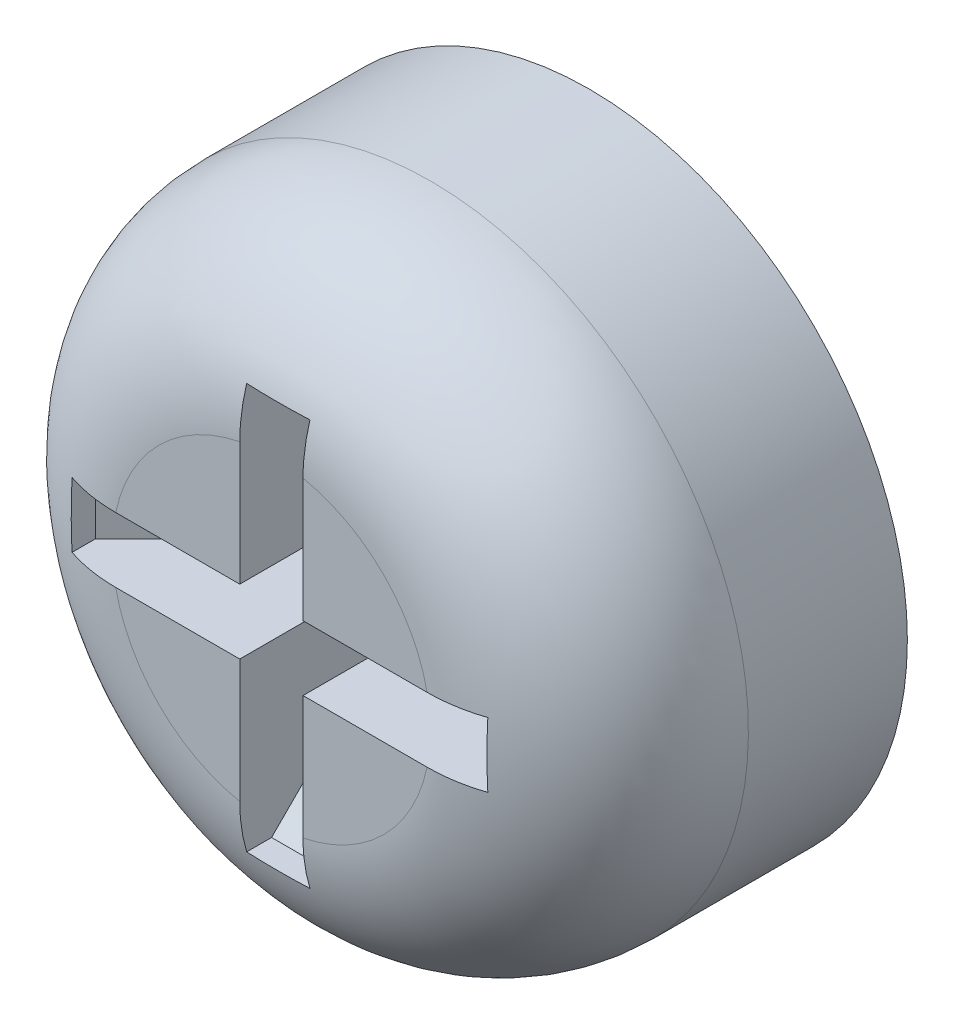
ISO-10303-21;
HEADER;
FILE_DESCRIPTION(('STEP AP214'),'2;1');
FILE_NAME('part.step','',(''),(''),'','','');
FILE_SCHEMA(('AUTOMOTIVE_DESIGN { 1 0 10303 214 1 1 1 1 }'));
ENDSEC;
DATA;
#1=APPLICATION_CONTEXT('core data for automotive mechanical design processes');
#2=APPLICATION_PROTOCOL_DEFINITION('international standard','automotive_design',2000,#1);
#3=PRODUCT_CONTEXT('',#1,'mechanical');
#4=PRODUCT('Part','Part','',(#3));
#5=PRODUCT_RELATED_PRODUCT_CATEGORY('part','',(#4));
#6=PRODUCT_DEFINITION_FORMATION('','',#4);
#7=PRODUCT_DEFINITION_CONTEXT('part definition',#1,'design');
#8=PRODUCT_DEFINITION('design','',#6,#7);
#9=PRODUCT_DEFINITION_SHAPE('','',#8);
#10=(LENGTH_UNIT() NAMED_UNIT(*) SI_UNIT(.MILLI.,.METRE.));
#11=(NAMED_UNIT(*) PLANE_ANGLE_UNIT() SI_UNIT($,.RADIAN.));
#12=(NAMED_UNIT(*) SI_UNIT($,.STERADIAN.) SOLID_ANGLE_UNIT());
#13=UNCERTAINTY_MEASURE_WITH_UNIT(LENGTH_MEASURE(1.E-05),#10,'distance_accuracy_value','');
#14=(GEOMETRIC_REPRESENTATION_CONTEXT(3) GLOBAL_UNCERTAINTY_ASSIGNED_CONTEXT((#13)) GLOBAL_UNIT_ASSIGNED_CONTEXT((#10,
#11,#12)) REPRESENTATION_CONTEXT('',''));
#15=CARTESIAN_POINT('',(0.,0.,0.));
#16=DIRECTION('',(0.,0.,1.));
#17=DIRECTION('',(1.,0.,0.));
#18=AXIS2_PLACEMENT_3D('',#15,#16,#17);
#19=CARTESIAN_POINT('',(25.3989609185,-17.47602795822,-1.7));
#20=DIRECTION('',(0.,0.707106781186498,0.707106781186598));
#21=DIRECTION('',(0.,-0.707106781186598,0.707106781186498));
#22=AXIS2_PLACEMENT_3D('',#19,#20,#21);
#23=PLANE('',#22);
#24=DIRECTION('',(1.,0.,0.));
#25=VECTOR('',#24,1.);
#26=CARTESIAN_POINT('',(25.3989609185,-17.47602795822,-1.7));
#27=LINE('',#26,#25);
#28=CARTESIAN_POINT('',(25.3989609185,-17.47602795822,-1.7));
#29=VERTEX_POINT('',#28);
#30=CARTESIAN_POINT('',(25.0010390815,-17.47602795822,-1.7));
#31=VERTEX_POINT('',#30);
#32=EDGE_CURVE('E428',#29,#31,#27,.F.);
#33=ORIENTED_EDGE('',*,*,#32,.T.);
#34=DIRECTION('',(0.,-0.707106781186548,0.707106781186547));
#35=VECTOR('',#34,1.);
#36=CARTESIAN_POINT('',(25.0010390815,-17.47602795822,-1.7));
#37=LINE('',#36,#35);
#38=CARTESIAN_POINT('',(25.0010390815,-18.47602795822,-0.700000000000023));
#39=VERTEX_POINT('',#38);
#40=EDGE_CURVE('E175',#31,#39,#37,.T.);
#41=ORIENTED_EDGE('',*,*,#40,.T.);
#42=DIRECTION('',(1.,0.,0.));
#43=VECTOR('',#42,1.);
#44=CARTESIAN_POINT('',(25.3989609185,-18.4760279582201,-0.70000000000007));
#45=LINE('',#44,#43);
#46=CARTESIAN_POINT('',(25.3989609185,-18.47602795822,-0.700000000000023));
#47=VERTEX_POINT('',#46);
#48=EDGE_CURVE('E431',#39,#47,#45,.T.);
#49=ORIENTED_EDGE('',*,*,#48,.T.);
#50=DIRECTION('',(0.,0.707106781186548,-0.707106781186547));
#51=VECTOR('',#50,1.);
#52=CARTESIAN_POINT('',(25.3989609185,-18.47602795822,-0.7));
#53=LINE('',#52,#51);
#54=EDGE_CURVE('E374',#47,#29,#53,.T.);
#55=ORIENTED_EDGE('',*,*,#54,.T.);
#56=EDGE_LOOP('',(#33,#41,#49,#55));
#57=FACE_BOUND('',#56,.T.);
#58=ADVANCED_FACE('F17',(#57),#23,.T.);
#59=CARTESIAN_POINT('',(24.89255224611,-16.99614004198,-1.7));
#60=DIRECTION('',(0.707106781186498,0.,0.707106781186598));
#61=DIRECTION('',(0.707106781186598,0.,-0.707106781186498));
#62=AXIS2_PLACEMENT_3D('',#59,#60,#61);
#63=PLANE('',#62);
#64=DIRECTION('',(0.,1.,0.));
#65=VECTOR('',#64,1.);
#66=CARTESIAN_POINT('',(24.89255224611,-16.99614004198,-1.7));
#67=LINE('',#66,#65);
#68=CARTESIAN_POINT('',(24.89255224611,-17.40385995802,-1.7));
#69=VERTEX_POINT('',#68);
#70=CARTESIAN_POINT('',(24.89255224611,-16.99614004198,-1.7));
#71=VERTEX_POINT('',#70);
#72=EDGE_CURVE('E394',#69,#71,#67,.T.);
#73=ORIENTED_EDGE('',*,*,#72,.T.);
#74=DIRECTION('',(-0.707106781186548,0.,0.707106781186547));
#75=VECTOR('',#74,1.);
#76=CARTESIAN_POINT('',(24.89255224611,-16.99614004198,-1.7));
#77=LINE('',#76,#75);
#78=CARTESIAN_POINT('',(23.89255224611,-16.99614004198,-0.700000000000023));
#79=VERTEX_POINT('',#78);
#80=EDGE_CURVE('E347',#71,#79,#77,.T.);
#81=ORIENTED_EDGE('',*,*,#80,.T.);
#82=DIRECTION('',(0.,1.,0.));
#83=VECTOR('',#82,1.);
#84=CARTESIAN_POINT('',(23.8925522461099,-16.99614004198,-0.70000000000007));
#85=LINE('',#84,#83);
#86=CARTESIAN_POINT('',(23.89255224611,-17.40385995802,-0.700000000000023));
#87=VERTEX_POINT('',#86);
#88=EDGE_CURVE('E423',#79,#87,#85,.F.);
#89=ORIENTED_EDGE('',*,*,#88,.T.);
#90=DIRECTION('',(0.707106781186548,0.,-0.707106781186547));
#91=VECTOR('',#90,1.);
#92=CARTESIAN_POINT('',(23.89255224611,-17.40385995802,-0.7));
#93=LINE('',#92,#91);
#94=EDGE_CURVE('E182',#87,#69,#93,.T.);
#95=ORIENTED_EDGE('',*,*,#94,.T.);
#96=EDGE_LOOP('',(#73,#81,#89,#95));
#97=FACE_BOUND('',#96,.T.);
#98=ADVANCED_FACE('F207',(#97),#63,.T.);
#99=CARTESIAN_POINT('',(25.3989609185,-16.92397204178,-1.7));
#100=DIRECTION('',(0.,-0.707106781186498,0.707106781186598));
#101=DIRECTION('',(0.,-0.707106781186598,-0.707106781186498));
#102=AXIS2_PLACEMENT_3D('',#99,#100,#101);
#103=PLANE('',#102);
#104=DIRECTION('',(-1.,0.,0.));
#105=VECTOR('',#104,1.);
#106=CARTESIAN_POINT('',(25.3989609185,-16.92397204178,-1.7));
#107=LINE('',#106,#105);
#108=CARTESIAN_POINT('',(25.0010390815,-16.92397204178,-1.7));
#109=VERTEX_POINT('',#108);
#110=CARTESIAN_POINT('',(25.3989609185,-16.92397204178,-1.7));
#111=VERTEX_POINT('',#110);
#112=EDGE_CURVE('E137',#109,#111,#107,.F.);
#113=ORIENTED_EDGE('',*,*,#112,.T.);
#114=DIRECTION('',(0.,0.707106781186548,0.707106781186547));
#115=VECTOR('',#114,1.);
#116=CARTESIAN_POINT('',(25.3989609185,-16.92397204178,-1.7));
#117=LINE('',#116,#115);
#118=CARTESIAN_POINT('',(25.3989609185,-15.92397204178,-0.700000000000023));
#119=VERTEX_POINT('',#118);
#120=EDGE_CURVE('E318',#111,#119,#117,.T.);
#121=ORIENTED_EDGE('',*,*,#120,.T.);
#122=DIRECTION('',(1.,0.,0.));
#123=VECTOR('',#122,1.);
#124=CARTESIAN_POINT('',(25.3989609185,-15.9239720417799,-0.70000000000007));
#125=LINE('',#124,#123);
#126=CARTESIAN_POINT('',(25.0010390815,-15.92397204178,-0.700000000000023));
#127=VERTEX_POINT('',#126);
#128=EDGE_CURVE('E103',#119,#127,#125,.F.);
#129=ORIENTED_EDGE('',*,*,#128,.T.);
#130=DIRECTION('',(0.,-0.707106781186548,-0.707106781186547));
#131=VECTOR('',#130,1.);
#132=CARTESIAN_POINT('',(25.0010390815,-15.92397204178,-0.7));
#133=LINE('',#132,#131);
#134=EDGE_CURVE('E352',#127,#109,#133,.T.);
#135=ORIENTED_EDGE('',*,*,#134,.T.);
#136=EDGE_LOOP('',(#113,#121,#129,#135));
#137=FACE_BOUND('',#136,.T.);
#138=ADVANCED_FACE('F204',(#137),#103,.T.);
#139=CARTESIAN_POINT('',(25.3989609185,-17.40385995802,-1.7));
#140=DIRECTION('',(1.,0.,0.));
#141=DIRECTION('',(0.,0.,-1.));
#142=AXIS2_PLACEMENT_3D('',#139,#140,#141);
#143=PLANE('',#142);
#144=DIRECTION('',(0.,0.,-1.));
#145=VECTOR('',#144,1.);
#146=CARTESIAN_POINT('',(25.3989609185,-18.47602795822,-1.7));
#147=LINE('',#146,#145);
#148=CARTESIAN_POINT('',(25.3989609185,-18.47602795822,-0.543412720583564));
#149=VERTEX_POINT('',#148);
#150=EDGE_CURVE('E99',#149,#47,#147,.T.);
#151=ORIENTED_EDGE('',*,*,#150,.F.);
#152=CARTESIAN_POINT('',(25.3989609185,-18.1800074249283,-0.500000000000001));
#153=CARTESIAN_POINT('',(25.3989609185,-18.2300853910277,-0.499980357796871));
#154=CARTESIAN_POINT('',(25.3989609185,-18.2801184198633,-0.503616686595251));
#155=CARTESIAN_POINT('',(25.3989609185,-18.3543002289747,-0.514478317278701));
#156=CARTESIAN_POINT('',(25.3989609185,-18.3788592300385,-0.518992986288768));
#157=CARTESIAN_POINT('',(25.3989609185,-18.4277108091085,-0.529837370422199));
#158=CARTESIAN_POINT('',(25.3989609185,-18.452001260971,-0.536176659609582));
#159=CARTESIAN_POINT('',(25.3989609185,-18.47602795822,-0.543412720583619));
#160=B_SPLINE_CURVE_WITH_KNOTS('',3,(#152,#153,#154,#155,#156,#157,#158,#159),.UNSPECIFIED.,.F.,
.F.,(4,2,2,4),(0.,0.14999162541346,0.22484086434075,0.300090241175782),.UNSPECIFIED.);
#161=CARTESIAN_POINT('',(25.3989609185,-18.1800074249278,-0.500000000000001));
#162=VERTEX_POINT('',#161);
#163=EDGE_CURVE('E22',#162,#149,#160,.T.);
#164=ORIENTED_EDGE('',*,*,#163,.F.);
#165=DIRECTION('',(0.,1.,0.));
#166=VECTOR('',#165,1.);
#167=CARTESIAN_POINT('',(25.3989609185,-17.2,-0.5));
#168=LINE('',#167,#166);
#169=CARTESIAN_POINT('',(25.3989609185,-17.40385995802,-0.5));
#170=VERTEX_POINT('',#169);
#171=EDGE_CURVE('E96',#170,#162,#168,.F.);
#172=ORIENTED_EDGE('',*,*,#171,.F.);
#173=DIRECTION('',(0.,0.,1.));
#174=VECTOR('',#173,1.);
#175=CARTESIAN_POINT('',(25.3989609185,-17.40385995802,-1.7));
#176=LINE('',#175,#174);
#177=CARTESIAN_POINT('',(25.3989609185,-17.40385995802,-1.7));
#178=VERTEX_POINT('',#177);
#179=EDGE_CURVE('E188',#170,#178,#176,.F.);
#180=ORIENTED_EDGE('',*,*,#179,.T.);
#181=DIRECTION('',(0.,1.,0.));
#182=VECTOR('',#181,1.);
#183=CARTESIAN_POINT('',(25.3989609185,-16.99614004198,-1.7));
#184=LINE('',#183,#182);
#185=EDGE_CURVE('E385',#178,#29,#184,.F.);
#186=ORIENTED_EDGE('',*,*,#185,.T.);
#187=ORIENTED_EDGE('',*,*,#54,.F.);
#188=EDGE_LOOP('',(#151,#164,#172,#180,#186,#187));
#189=FACE_BOUND('',#188,.T.);
#190=ADVANCED_FACE('F93',(#189),#143,.F.);
#191=CARTESIAN_POINT('',(26.50744775389,-17.40385995802,-1.7));
#192=DIRECTION('',(0.,-1.,0.));
#193=DIRECTION('',(1.,0.,0.));
#194=AXIS2_PLACEMENT_3D('',#191,#192,#193);
#195=PLANE('',#194);
#196=DIRECTION('',(-1.,0.,0.));
#197=VECTOR('',#196,1.);
#198=CARTESIAN_POINT('',(25.3989609185,-17.40385995802,-1.7));
#199=LINE('',#198,#197);
#200=CARTESIAN_POINT('',(25.50744775389,-17.40385995802,-1.7));
#201=VERTEX_POINT('',#200);
#202=EDGE_CURVE('E357',#201,#178,#199,.T.);
#203=ORIENTED_EDGE('',*,*,#202,.T.);
#204=ORIENTED_EDGE('',*,*,#179,.F.);
#205=DIRECTION('',(1.,0.,0.));
#206=VECTOR('',#205,1.);
#207=CARTESIAN_POINT('',(25.2,-17.40385995802,-0.5));
#208=LINE('',#207,#206);
#209=CARTESIAN_POINT('',(26.1790000600197,-17.40385995802,-0.500000000000001));
#210=VERTEX_POINT('',#209);
#211=EDGE_CURVE('E110',#210,#170,#208,.F.);
#212=ORIENTED_EDGE('',*,*,#211,.F.);
#213=CARTESIAN_POINT('',(26.5074477538897,-17.40385995802,-0.553684840378902));
#214=CARTESIAN_POINT('',(26.4809616911325,-17.40385995802,-0.544740749820176));
#215=CARTESIAN_POINT('',(26.4541118836972,-17.40385995802,-0.536901162363056));
#216=CARTESIAN_POINT('',(26.4000380078882,-17.40385995802,-0.52349492906921));
#217=CARTESIAN_POINT('',(26.3728175657446,-17.40385995802,-0.517913663442635));
#218=CARTESIAN_POINT('',(26.2904621558708,-17.40385995802,-0.50447630877751));
#219=CARTESIAN_POINT('',(26.2347621564866,-17.40385995802,-0.499969818068343));
#220=CARTESIAN_POINT('',(26.1790000600194,-17.40385995802,-0.500000000000001));
#221=B_SPLINE_CURVE_WITH_KNOTS('',3,(#213,#214,#215,#216,#217,#218,#219,#220),.UNSPECIFIED.,.F.,
.F.,(4,2,2,4),(0.,0.0838260991151288,0.167100496555799,0.334052422074311),.UNSPECIFIED.);
#222=CARTESIAN_POINT('',(26.5074477538898,-17.40385995802,-0.553684840378889));
#223=VERTEX_POINT('',#222);
#224=EDGE_CURVE('E116',#223,#210,#221,.T.);
#225=ORIENTED_EDGE('',*,*,#224,.F.);
#226=DIRECTION('',(0.,0.,1.));
#227=VECTOR('',#226,1.);
#228=CARTESIAN_POINT('',(26.50744775389,-17.40385995802,-1.7));
#229=LINE('',#228,#227);
#230=CARTESIAN_POINT('',(26.50744775389,-17.40385995802,-0.700000000000047));
#231=VERTEX_POINT('',#230);
#232=EDGE_CURVE('E371',#231,#223,#229,.T.);
#233=ORIENTED_EDGE('',*,*,#232,.F.);
#234=DIRECTION('',(0.707106781186598,0.,0.707106781186498));
#235=VECTOR('',#234,1.);
#236=CARTESIAN_POINT('',(25.50744775389,-17.40385995802,-1.7));
#237=LINE('',#236,#235);
#238=EDGE_CURVE('E111',#201,#231,#237,.T.);
#239=ORIENTED_EDGE('',*,*,#238,.F.);
#240=EDGE_LOOP('',(#203,#204,#212,#225,#233,#239));
#241=FACE_BOUND('',#240,.T.);
#242=ADVANCED_FACE('F196',(#241),#195,.F.);
#243=CARTESIAN_POINT('',(25.0010390815,-17.40385995802,-1.7));
#244=DIRECTION('',(0.,-1.,0.));
#245=DIRECTION('',(1.,0.,0.));
#246=AXIS2_PLACEMENT_3D('',#243,#244,#245);
#247=PLANE('',#246);
#248=DIRECTION('',(0.,0.,1.));
#249=VECTOR('',#248,1.);
#250=CARTESIAN_POINT('',(23.89255224611,-17.40385995802,-1.7));
#251=LINE('',#250,#249);
#252=CARTESIAN_POINT('',(23.89255224611,-17.4038599580199,-0.553684840377949));
#253=VERTEX_POINT('',#252);
#254=EDGE_CURVE('E187',#253,#87,#251,.F.);
#255=ORIENTED_EDGE('',*,*,#254,.F.);
#256=CARTESIAN_POINT('',(24.2209999399806,-17.40385995802,-0.500000000000001));
#257=CARTESIAN_POINT('',(24.1652378435135,-17.40385995802,-0.499969818068343));
#258=CARTESIAN_POINT('',(24.1095378441293,-17.40385995802,-0.5044763087775));
#259=CARTESIAN_POINT('',(24.0271824342556,-17.40385995802,-0.517913663442597));
#260=CARTESIAN_POINT('',(23.999961992112,-17.40385995802,-0.52349492906916));
#261=CARTESIAN_POINT('',(23.9458881163031,-17.40385995802,-0.536901162362978));
#262=CARTESIAN_POINT('',(23.9190383088679,-17.40385995802,-0.544740749820081));
#263=CARTESIAN_POINT('',(23.8925522461106,-17.40385995802,-0.553684840378789));
#264=B_SPLINE_CURVE_WITH_KNOTS('',3,(#256,#257,#258,#259,#260,#261,#262,#263),.UNSPECIFIED.,.F.,
.F.,(4,2,2,4),(0.,0.166951925518336,0.250226322958922,0.33405242207396),.UNSPECIFIED.);
#265=CARTESIAN_POINT('',(24.220999939979,-17.40385995802,-0.500000000000001));
#266=VERTEX_POINT('',#265);
#267=EDGE_CURVE('E183',#266,#253,#264,.T.);
#268=ORIENTED_EDGE('',*,*,#267,.F.);
#269=DIRECTION('',(1.,0.,0.));
#270=VECTOR('',#269,1.);
#271=CARTESIAN_POINT('',(25.2,-17.40385995802,-0.5));
#272=LINE('',#271,#270);
#273=CARTESIAN_POINT('',(25.0010390815,-17.40385995802,-0.5));
#274=VERTEX_POINT('',#273);
#275=EDGE_CURVE('E289',#274,#266,#272,.F.);
#276=ORIENTED_EDGE('',*,*,#275,.F.);
#277=DIRECTION('',(0.,0.,1.));
#278=VECTOR('',#277,1.);
#279=CARTESIAN_POINT('',(25.0010390815,-17.40385995802,-1.7));
#280=LINE('',#279,#278);
#281=CARTESIAN_POINT('',(25.0010390815,-17.40385995802,-1.7));
#282=VERTEX_POINT('',#281);
#283=EDGE_CURVE('E181',#274,#282,#280,.F.);
#284=ORIENTED_EDGE('',*,*,#283,.T.);
#285=DIRECTION('',(-1.,0.,0.));
#286=VECTOR('',#285,1.);
#287=CARTESIAN_POINT('',(25.3989609185,-17.40385995802,-1.7));
#288=LINE('',#287,#286);
#289=EDGE_CURVE('E413',#282,#69,#288,.T.);
#290=ORIENTED_EDGE('',*,*,#289,.T.);
#291=ORIENTED_EDGE('',*,*,#94,.F.);
#292=EDGE_LOOP('',(#255,#268,#276,#284,#290,#291));
#293=FACE_BOUND('',#292,.T.);
#294=ADVANCED_FACE('F193',(#293),#247,.F.);
#295=CARTESIAN_POINT('',(25.0010390815,-17.40385995802,-1.7));
#296=DIRECTION('',(-1.,0.,0.));
#297=DIRECTION('',(0.,0.,1.));
#298=AXIS2_PLACEMENT_3D('',#295,#296,#297);
#299=PLANE('',#298);
#300=DIRECTION('',(0.,1.,0.));
#301=VECTOR('',#300,1.);
#302=CARTESIAN_POINT('',(25.0010390815,-16.99614004198,-1.7));
#303=LINE('',#302,#301);
#304=EDGE_CURVE('E418',#31,#282,#303,.T.);
#305=ORIENTED_EDGE('',*,*,#304,.T.);
#306=ORIENTED_EDGE('',*,*,#283,.F.);
#307=DIRECTION('',(0.,1.,0.));
#308=VECTOR('',#307,1.);
#309=CARTESIAN_POINT('',(25.0010390815,-17.2,-0.5));
#310=LINE('',#309,#308);
#311=CARTESIAN_POINT('',(25.0010390815,-18.1800074249292,-0.500000000000001));
#312=VERTEX_POINT('',#311);
#313=EDGE_CURVE('E287',#312,#274,#310,.T.);
#314=ORIENTED_EDGE('',*,*,#313,.F.);
#315=CARTESIAN_POINT('',(25.0010390815,-18.4760279582202,-0.543412720583684));
#316=CARTESIAN_POINT('',(25.0010390815,-18.4520012609712,-0.536176659609636));
#317=CARTESIAN_POINT('',(25.0010390815,-18.4277108091087,-0.529837370422244));
#318=CARTESIAN_POINT('',(25.0010390815,-18.3788592300387,-0.518992986288797));
#319=CARTESIAN_POINT('',(25.0010390815,-18.3543002289748,-0.514478317278722));
#320=CARTESIAN_POINT('',(25.0010390815,-18.2801184198633,-0.503616686595257));
#321=CARTESIAN_POINT('',(25.0010390815,-18.2300853910277,-0.499980357796872));
#322=CARTESIAN_POINT('',(25.0010390815,-18.1800074249283,-0.500000000000001));
#323=B_SPLINE_CURVE_WITH_KNOTS('',3,(#315,#316,#317,#318,#319,#320,#321,#322),.UNSPECIFIED.,.F.,
.F.,(4,2,2,4),(0.,0.0752493768350856,0.150098615762434,0.300090241176003),.UNSPECIFIED.);
#324=CARTESIAN_POINT('',(25.0010390815,-18.4760279582201,-0.543412720583992));
#325=VERTEX_POINT('',#324);
#326=EDGE_CURVE('E176',#325,#312,#323,.T.);
#327=ORIENTED_EDGE('',*,*,#326,.F.);
#328=DIRECTION('',(0.,0.,-1.));
#329=VECTOR('',#328,1.);
#330=CARTESIAN_POINT('',(25.0010390815,-18.47602795822,-1.7));
#331=LINE('',#330,#329);
#332=EDGE_CURVE('E291',#325,#39,#331,.T.);
#333=ORIENTED_EDGE('',*,*,#332,.T.);
#334=ORIENTED_EDGE('',*,*,#40,.F.);
#335=EDGE_LOOP('',(#305,#306,#314,#327,#333,#334));
#336=FACE_BOUND('',#335,.T.);
#337=ADVANCED_FACE('F164',(#336),#299,.F.);
#338=CARTESIAN_POINT('',(25.0010390815,-15.92397204178,-1.7));
#339=DIRECTION('',(-1.,0.,0.));
#340=DIRECTION('',(0.,-1.,0.));
#341=AXIS2_PLACEMENT_3D('',#338,#339,#340);
#342=PLANE('',#341);
#343=DIRECTION('',(0.,0.,1.));
#344=VECTOR('',#343,1.);
#345=CARTESIAN_POINT('',(25.0010390815,-15.92397204178,-1.7));
#346=LINE('',#345,#344);
#347=CARTESIAN_POINT('',(25.0010390815,-15.92397204178,-0.543412720583561));
#348=VERTEX_POINT('',#347);
#349=EDGE_CURVE('E174',#348,#127,#346,.F.);
#350=ORIENTED_EDGE('',*,*,#349,.F.);
#351=CARTESIAN_POINT('',(25.0010390815,-16.2199925750717,-0.499999999999994));
#352=CARTESIAN_POINT('',(25.0010390815,-16.1699146089723,-0.499980357796868));
#353=CARTESIAN_POINT('',(25.0010390815,-16.1198815801367,-0.503616686595251));
#354=CARTESIAN_POINT('',(25.0010390815,-16.0456997710253,-0.514478317278702));
#355=CARTESIAN_POINT('',(25.0010390815,-16.0211407699615,-0.51899298628877));
#356=CARTESIAN_POINT('',(25.0010390815,-15.9722891908915,-0.529837370422198));
#357=CARTESIAN_POINT('',(25.0010390815,-15.947998739029,-0.536176659609579));
#358=CARTESIAN_POINT('',(25.0010390815,-15.92397204178,-0.543412720583613));
#359=B_SPLINE_CURVE_WITH_KNOTS('',3,(#351,#352,#353,#354,#355,#356,#357,#358),.UNSPECIFIED.,.F.,
.F.,(4,2,2,4),(0.,0.149991625413454,0.224840864340744,0.30009024117577),.UNSPECIFIED.);
#360=CARTESIAN_POINT('',(25.0010390815,-16.2199925750722,-0.499999999999994));
#361=VERTEX_POINT('',#360);
#362=EDGE_CURVE('E168',#361,#348,#359,.T.);
#363=ORIENTED_EDGE('',*,*,#362,.F.);
#364=DIRECTION('',(0.,1.,0.));
#365=VECTOR('',#364,1.);
#366=CARTESIAN_POINT('',(25.0010390815,-17.2,-0.5));
#367=LINE('',#366,#365);
#368=CARTESIAN_POINT('',(25.0010390815,-16.99614004198,-0.5));
#369=VERTEX_POINT('',#368);
#370=EDGE_CURVE('E525',#369,#361,#367,.T.);
#371=ORIENTED_EDGE('',*,*,#370,.F.);
#372=DIRECTION('',(0.,0.,1.));
#373=VECTOR('',#372,1.);
#374=CARTESIAN_POINT('',(25.0010390815,-16.99614004198,-1.7));
#375=LINE('',#374,#373);
#376=CARTESIAN_POINT('',(25.0010390815,-16.99614004198,-1.7));
#377=VERTEX_POINT('',#376);
#378=EDGE_CURVE('E344',#369,#377,#375,.F.);
#379=ORIENTED_EDGE('',*,*,#378,.T.);
#380=DIRECTION('',(0.,1.,0.));
#381=VECTOR('',#380,1.);
#382=CARTESIAN_POINT('',(25.0010390815,-16.99614004198,-1.7));
#383=LINE('',#382,#381);
#384=EDGE_CURVE('E399',#377,#109,#383,.T.);
#385=ORIENTED_EDGE('',*,*,#384,.T.);
#386=ORIENTED_EDGE('',*,*,#134,.F.);
#387=EDGE_LOOP('',(#350,#363,#371,#379,#385,#386));
#388=FACE_BOUND('',#387,.T.);
#389=ADVANCED_FACE('F159',(#388),#342,.F.);
#390=CARTESIAN_POINT('',(25.0010390815,-16.99614004198,-1.7));
#391=DIRECTION('',(0.,1.,0.));
#392=DIRECTION('',(-1.,0.,0.));
#393=AXIS2_PLACEMENT_3D('',#390,#391,#392);
#394=PLANE('',#393);
#395=DIRECTION('',(-1.,0.,0.));
#396=VECTOR('',#395,1.);
#397=CARTESIAN_POINT('',(25.3989609185,-16.99614004198,-1.7));
#398=LINE('',#397,#396);
#399=EDGE_CURVE('E404',#71,#377,#398,.F.);
#400=ORIENTED_EDGE('',*,*,#399,.T.);
#401=ORIENTED_EDGE('',*,*,#378,.F.);
#402=DIRECTION('',(1.,0.,0.));
#403=VECTOR('',#402,1.);
#404=CARTESIAN_POINT('',(25.2,-16.99614004198,-0.5));
#405=LINE('',#404,#403);
#406=CARTESIAN_POINT('',(24.2209999399803,-16.99614004198,-0.499999999999994));
#407=VERTEX_POINT('',#406);
#408=EDGE_CURVE('E528',#407,#369,#405,.T.);
#409=ORIENTED_EDGE('',*,*,#408,.F.);
#410=CARTESIAN_POINT('',(23.8925522461103,-16.99614004198,-0.553684840378895));
#411=CARTESIAN_POINT('',(23.9190383088675,-16.99614004198,-0.544740749820172));
#412=CARTESIAN_POINT('',(23.9458881163028,-16.99614004198,-0.536901162363054));
#413=CARTESIAN_POINT('',(23.9999619921118,-16.99614004198,-0.523494929069209));
#414=CARTESIAN_POINT('',(24.0271824342554,-16.99614004198,-0.517913663442636));
#415=CARTESIAN_POINT('',(24.1095378441292,-16.99614004198,-0.504476308777509));
#416=CARTESIAN_POINT('',(24.1652378435134,-16.99614004198,-0.499969818068338));
#417=CARTESIAN_POINT('',(24.2209999399806,-16.99614004198,-0.499999999999994));
#418=B_SPLINE_CURVE_WITH_KNOTS('',3,(#410,#411,#412,#413,#414,#415,#416,#417),.UNSPECIFIED.,.F.,
.F.,(4,2,2,4),(0.,0.0838260991151272,0.167100496555794,0.33405242207431),.UNSPECIFIED.);
#419=CARTESIAN_POINT('',(23.8925522461102,-16.99614004198,-0.553684840378448));
#420=VERTEX_POINT('',#419);
#421=EDGE_CURVE('E138',#420,#407,#418,.T.);
#422=ORIENTED_EDGE('',*,*,#421,.F.);
#423=DIRECTION('',(0.,0.,1.));
#424=VECTOR('',#423,1.);
#425=CARTESIAN_POINT('',(23.89255224611,-16.99614004198,-1.7));
#426=LINE('',#425,#424);
#427=EDGE_CURVE('E293',#420,#79,#426,.F.);
#428=ORIENTED_EDGE('',*,*,#427,.T.);
#429=ORIENTED_EDGE('',*,*,#80,.F.);
#430=EDGE_LOOP('',(#400,#401,#409,#422,#428,#429));
#431=FACE_BOUND('',#430,.T.);
#432=ADVANCED_FACE('F154',(#431),#394,.F.);
#433=CARTESIAN_POINT('',(25.3989609185,-16.99614004198,-1.7));
#434=DIRECTION('',(0.,0.,-1.));
#435=DIRECTION('',(-1.,0.,0.));
#436=AXIS2_PLACEMENT_3D('',#433,#434,#435);
#437=PLANE('',#436);
#438=ORIENTED_EDGE('',*,*,#384,.F.);
#439=ORIENTED_EDGE('',*,*,#399,.F.);
#440=ORIENTED_EDGE('',*,*,#72,.F.);
#441=ORIENTED_EDGE('',*,*,#289,.F.);
#442=ORIENTED_EDGE('',*,*,#304,.F.);
#443=ORIENTED_EDGE('',*,*,#32,.F.);
#444=ORIENTED_EDGE('',*,*,#185,.F.);
#445=ORIENTED_EDGE('',*,*,#202,.F.);
#446=DIRECTION('',(0.,1.,0.));
#447=VECTOR('',#446,1.);
#448=CARTESIAN_POINT('',(25.50744775389,-16.99614004198,-1.7));
#449=LINE('',#448,#447);
#450=CARTESIAN_POINT('',(25.50744775389,-16.99614004198,-1.7));
#451=VERTEX_POINT('',#450);
#452=EDGE_CURVE('E317',#451,#201,#449,.F.);
#453=ORIENTED_EDGE('',*,*,#452,.F.);
#454=DIRECTION('',(1.,0.,0.));
#455=VECTOR('',#454,1.);
#456=CARTESIAN_POINT('',(26.50744775389,-16.99614004198,-1.7));
#457=LINE('',#456,#455);
#458=CARTESIAN_POINT('',(25.3989609185,-16.99614004198,-1.7));
#459=VERTEX_POINT('',#458);
#460=EDGE_CURVE('E325',#451,#459,#457,.F.);
#461=ORIENTED_EDGE('',*,*,#460,.T.);
#462=DIRECTION('',(0.,1.,0.));
#463=VECTOR('',#462,1.);
#464=CARTESIAN_POINT('',(25.3989609185,-15.92397204178,-1.7));
#465=LINE('',#464,#463);
#466=EDGE_CURVE('E136',#459,#111,#465,.T.);
#467=ORIENTED_EDGE('',*,*,#466,.T.);
#468=ORIENTED_EDGE('',*,*,#112,.F.);
#469=EDGE_LOOP('',(#438,#439,#440,#441,#442,#443,#444,#445,#453,#461,#467,#468));
#470=FACE_BOUND('',#469,.T.);
#471=ADVANCED_FACE('F150',(#470),#437,.F.);
#472=CARTESIAN_POINT('',(25.3989609185,-15.92397204178,-1.7));
#473=DIRECTION('',(1.,0.,0.));
#474=DIRECTION('',(0.,1.,0.));
#475=AXIS2_PLACEMENT_3D('',#472,#473,#474);
#476=PLANE('',#475);
#477=ORIENTED_EDGE('',*,*,#466,.F.);
#478=DIRECTION('',(0.,0.,1.));
#479=VECTOR('',#478,1.);
#480=CARTESIAN_POINT('',(25.3989609185,-16.99614004198,-1.7));
#481=LINE('',#480,#479);
#482=CARTESIAN_POINT('',(25.3989609185,-16.99614004198,-0.5));
#483=VERTEX_POINT('',#482);
#484=EDGE_CURVE('E328',#459,#483,#481,.T.);
#485=ORIENTED_EDGE('',*,*,#484,.T.);
#486=DIRECTION('',(0.,1.,0.));
#487=VECTOR('',#486,1.);
#488=CARTESIAN_POINT('',(25.3989609185,-17.2,-0.5));
#489=LINE('',#488,#487);
#490=CARTESIAN_POINT('',(25.3989609185,-16.2199925750708,-0.499999999999994));
#491=VERTEX_POINT('',#490);
#492=EDGE_CURVE('E329',#491,#483,#489,.F.);
#493=ORIENTED_EDGE('',*,*,#492,.F.);
#494=CARTESIAN_POINT('',(25.3989609185,-15.9239720417798,-0.543412720583679));
#495=CARTESIAN_POINT('',(25.3989609185,-15.9479987390288,-0.536176659609634));
#496=CARTESIAN_POINT('',(25.3989609185,-15.9722891908913,-0.529837370422244));
#497=CARTESIAN_POINT('',(25.3989609185,-16.0211407699614,-0.518992986288798));
#498=CARTESIAN_POINT('',(25.3989609185,-16.0456997710252,-0.514478317278724));
#499=CARTESIAN_POINT('',(25.3989609185,-16.1198815801367,-0.503616686595256));
#500=CARTESIAN_POINT('',(25.3989609185,-16.1699146089723,-0.499980357796867));
#501=CARTESIAN_POINT('',(25.3989609185,-16.2199925750717,-0.499999999999994));
#502=B_SPLINE_CURVE_WITH_KNOTS('',3,(#494,#495,#496,#497,#498,#499,#500,#501),.UNSPECIFIED.,.F.,
.F.,(4,2,2,4),(0.,0.0752493768350875,0.150098615762436,0.300090241176005),.UNSPECIFIED.);
#503=CARTESIAN_POINT('',(25.3989609185,-15.9239720417799,-0.54341272058399));
#504=VERTEX_POINT('',#503);
#505=EDGE_CURVE('E130',#504,#491,#502,.T.);
#506=ORIENTED_EDGE('',*,*,#505,.F.);
#507=DIRECTION('',(0.,0.,1.));
#508=VECTOR('',#507,1.);
#509=CARTESIAN_POINT('',(25.3989609185,-15.92397204178,-1.7));
#510=LINE('',#509,#508);
#511=EDGE_CURVE('E539',#504,#119,#510,.F.);
#512=ORIENTED_EDGE('',*,*,#511,.T.);
#513=ORIENTED_EDGE('',*,*,#120,.F.);
#514=EDGE_LOOP('',(#477,#485,#493,#506,#512,#513));
#515=FACE_BOUND('',#514,.T.);
#516=ADVANCED_FACE('F144',(#515),#476,.F.);
#517=CARTESIAN_POINT('',(25.50744775389,-16.99614004198,-1.7));
#518=DIRECTION('',(-0.707106781186498,0.,0.707106781186598));
#519=DIRECTION('',(0.707106781186598,0.,0.707106781186498));
#520=AXIS2_PLACEMENT_3D('',#517,#518,#519);
#521=PLANE('',#520);
#522=ORIENTED_EDGE('',*,*,#452,.T.);
#523=ORIENTED_EDGE('',*,*,#238,.T.);
#524=DIRECTION('',(0.,1.,0.));
#525=VECTOR('',#524,1.);
#526=CARTESIAN_POINT('',(26.5074477538901,-16.99614004198,-0.70000000000007));
#527=LINE('',#526,#525);
#528=CARTESIAN_POINT('',(26.50744775389,-16.99614004198,-0.700000000000023));
#529=VERTEX_POINT('',#528);
#530=EDGE_CURVE('E314',#231,#529,#527,.T.);
#531=ORIENTED_EDGE('',*,*,#530,.T.);
#532=DIRECTION('',(-0.707106781186548,0.,-0.707106781186547));
#533=VECTOR('',#532,1.);
#534=CARTESIAN_POINT('',(26.50744775389,-16.99614004198,-0.7));
#535=LINE('',#534,#533);
#536=EDGE_CURVE('E122',#529,#451,#535,.T.);
#537=ORIENTED_EDGE('',*,*,#536,.T.);
#538=EDGE_LOOP('',(#522,#523,#531,#537));
#539=FACE_BOUND('',#538,.T.);
#540=ADVANCED_FACE('F149',(#539),#521,.T.);
#541=CARTESIAN_POINT('',(25.2,-17.2,-0.5));
#542=DIRECTION('',(0.,0.,1.));
#543=DIRECTION('',(1.,0.,0.));
#544=AXIS2_PLACEMENT_3D('',#541,#542,#543);
#545=PLANE('',#544);
#546=CARTESIAN_POINT('',(25.2,-17.2,-0.500000000000001));
#547=DIRECTION('',(0.,0.,1.));
#548=DIRECTION('',(1.,0.,0.));
#549=AXIS2_PLACEMENT_3D('',#546,#547,#548);
#550=CIRCLE('',#549,1.00000000000154);
#551=EDGE_CURVE('E108',#210,#162,#550,.F.);
#552=ORIENTED_EDGE('',*,*,#551,.F.);
#553=ORIENTED_EDGE('',*,*,#211,.T.);
#554=ORIENTED_EDGE('',*,*,#171,.T.);
#555=EDGE_LOOP('',(#552,#553,#554));
#556=FACE_BOUND('',#555,.T.);
#557=ADVANCED_FACE('F107',(#556),#545,.T.);
#558=CARTESIAN_POINT('',(25.3989609185,-18.47602795822,-1.7));
#559=DIRECTION('',(0.,-1.,0.));
#560=DIRECTION('',(0.,0.,-1.));
#561=AXIS2_PLACEMENT_3D('',#558,#559,#560);
#562=PLANE('',#561);
#563=ORIENTED_EDGE('',*,*,#332,.F.);
#564=CARTESIAN_POINT('',(25.3989609185,-18.47602795822,-0.543412720583628));
#565=CARTESIAN_POINT('',(25.3326406123333,-18.47602795822,-0.54037116912315));
#566=CARTESIAN_POINT('',(25.2663203061667,-18.47602795822,-0.538850393392911));
#567=CARTESIAN_POINT('',(25.1336796938333,-18.47602795822,-0.538850393392911));
#568=CARTESIAN_POINT('',(25.0673593876666,-18.47602795822,-0.540371169123151));
#569=CARTESIAN_POINT('',(25.0010390815,-18.47602795822,-0.54341272058363));
#570=B_SPLINE_CURVE_WITH_KNOTS('',3,(#564,#565,#566,#567,#568,#569),.UNSPECIFIED.,.F.,.F.,(4,2,
4),(0.,0.199013220464786,0.398026440929573),.UNSPECIFIED.);
#571=EDGE_CURVE('E117',#149,#325,#570,.T.);
#572=ORIENTED_EDGE('',*,*,#571,.F.);
#573=ORIENTED_EDGE('',*,*,#150,.T.);
#574=ORIENTED_EDGE('',*,*,#48,.F.);
#575=EDGE_LOOP('',(#563,#572,#573,#574));
#576=FACE_BOUND('',#575,.T.);
#577=ADVANCED_FACE('F621',(#576),#562,.F.);
#578=CARTESIAN_POINT('',(25.2,-17.2,-0.5));
#579=DIRECTION('',(0.,0.,1.));
#580=DIRECTION('',(1.,0.,0.));
#581=AXIS2_PLACEMENT_3D('',#578,#579,#580);
#582=PLANE('',#581);
#583=CARTESIAN_POINT('',(25.2,-17.2,-0.500000000000001));
#584=DIRECTION('',(0.,0.,1.));
#585=DIRECTION('',(1.,0.,0.));
#586=AXIS2_PLACEMENT_3D('',#583,#584,#585);
#587=CIRCLE('',#586,1.00000000000415);
#588=EDGE_CURVE('E120',#312,#266,#587,.F.);
#589=ORIENTED_EDGE('',*,*,#588,.F.);
#590=ORIENTED_EDGE('',*,*,#313,.T.);
#591=ORIENTED_EDGE('',*,*,#275,.T.);
#592=EDGE_LOOP('',(#589,#590,#591));
#593=FACE_BOUND('',#592,.T.);
#594=ADVANCED_FACE('F273',(#593),#582,.T.);
#595=CARTESIAN_POINT('',(23.89255224611,-16.99614004198,-1.7));
#596=DIRECTION('',(-1.,0.,0.));
#597=DIRECTION('',(0.,0.,1.));
#598=AXIS2_PLACEMENT_3D('',#595,#596,#597);
#599=PLANE('',#598);
#600=ORIENTED_EDGE('',*,*,#427,.F.);
#601=CARTESIAN_POINT('',(23.89255224611,-17.4038599580199,-0.553684840378998));
#602=CARTESIAN_POINT('',(23.89255224611,-17.3699025626678,-0.551906827398217));
#603=CARTESIAN_POINT('',(23.89255224611,-17.3359222674717,-0.550594095803462));
#604=CARTESIAN_POINT('',(23.89255224611,-17.2679613047429,-0.548858495135933));
#605=CARTESIAN_POINT('',(23.89255224611,-17.2339806523714,-0.548435037095201));
#606=CARTESIAN_POINT('',(23.89255224611,-17.1660193476286,-0.548435037095208));
#607=CARTESIAN_POINT('',(23.89255224611,-17.1320386952571,-0.548858495135948));
#608=CARTESIAN_POINT('',(23.89255224611,-17.0640777325282,-0.550594095803449));
#609=CARTESIAN_POINT('',(23.89255224611,-17.0300974373321,-0.551906827398169));
#610=CARTESIAN_POINT('',(23.89255224611,-16.9961400419801,-0.55368484037887));
#611=B_SPLINE_CURVE_WITH_KNOTS('',3,(#601,#602,#603,#604,#605,#606,#607,#608,#609,#610),
.UNSPECIFIED.,.F.,.F.,(4,2,2,2,4),(0.,0.102006281357063,0.203944982380749,0.305883683404466,
0.407889964761555),.UNSPECIFIED.);
#612=EDGE_CURVE('E275',#253,#420,#611,.T.);
#613=ORIENTED_EDGE('',*,*,#612,.F.);
#614=ORIENTED_EDGE('',*,*,#254,.T.);
#615=ORIENTED_EDGE('',*,*,#88,.F.);
#616=EDGE_LOOP('',(#600,#613,#614,#615));
#617=FACE_BOUND('',#616,.T.);
#618=ADVANCED_FACE('F268',(#617),#599,.F.);
#619=CARTESIAN_POINT('',(25.2,-17.2,-0.5));
#620=DIRECTION('',(0.,0.,1.));
#621=DIRECTION('',(1.,0.,0.));
#622=AXIS2_PLACEMENT_3D('',#619,#620,#621);
#623=PLANE('',#622);
#624=CARTESIAN_POINT('',(25.2,-17.2,-0.499999999999994));
#625=DIRECTION('',(0.,0.,1.));
#626=DIRECTION('',(1.,0.,0.));
#627=AXIS2_PLACEMENT_3D('',#624,#625,#626);
#628=CIRCLE('',#627,1.00000000000154);
#629=EDGE_CURVE('E257',#407,#361,#628,.F.);
#630=ORIENTED_EDGE('',*,*,#629,.F.);
#631=ORIENTED_EDGE('',*,*,#408,.T.);
#632=ORIENTED_EDGE('',*,*,#370,.T.);
#633=EDGE_LOOP('',(#630,#631,#632));
#634=FACE_BOUND('',#633,.T.);
#635=ADVANCED_FACE('F264',(#634),#623,.T.);
#636=CARTESIAN_POINT('',(25.3989609185,-15.92397204178,-1.7));
#637=DIRECTION('',(0.,1.,0.));
#638=DIRECTION('',(0.,0.,1.));
#639=AXIS2_PLACEMENT_3D('',#636,#637,#638);
#640=PLANE('',#639);
#641=ORIENTED_EDGE('',*,*,#511,.F.);
#642=CARTESIAN_POINT('',(25.0010390815,-15.92397204178,-0.543412720583622));
#643=CARTESIAN_POINT('',(25.0673593876667,-15.92397204178,-0.540371169123149));
#644=CARTESIAN_POINT('',(25.1336796938334,-15.92397204178,-0.538850393392912));
#645=CARTESIAN_POINT('',(25.2663203061667,-15.92397204178,-0.538850393392913));
#646=CARTESIAN_POINT('',(25.3326406123334,-15.92397204178,-0.54037116912315));
#647=CARTESIAN_POINT('',(25.3989609185,-15.92397204178,-0.543412720583625));
#648=B_SPLINE_CURVE_WITH_KNOTS('',3,(#642,#643,#644,#645,#646,#647),.UNSPECIFIED.,.F.,.F.,(4,2,
4),(0.,0.199013220464779,0.398026440929558),.UNSPECIFIED.);
#649=EDGE_CURVE('E250',#348,#504,#648,.T.);
#650=ORIENTED_EDGE('',*,*,#649,.F.);
#651=ORIENTED_EDGE('',*,*,#349,.T.);
#652=ORIENTED_EDGE('',*,*,#128,.F.);
#653=EDGE_LOOP('',(#641,#650,#651,#652));
#654=FACE_BOUND('',#653,.T.);
#655=ADVANCED_FACE('F259',(#654),#640,.F.);
#656=CARTESIAN_POINT('',(25.2,-17.2,-0.5));
#657=DIRECTION('',(0.,0.,1.));
#658=DIRECTION('',(1.,0.,0.));
#659=AXIS2_PLACEMENT_3D('',#656,#657,#658);
#660=PLANE('',#659);
#661=CARTESIAN_POINT('',(25.2,-17.2,-0.499999999999994));
#662=DIRECTION('',(0.,0.,1.));
#663=DIRECTION('',(1.,0.,0.));
#664=AXIS2_PLACEMENT_3D('',#661,#662,#663);
#665=CIRCLE('',#664,1.00000000000415);
#666=CARTESIAN_POINT('',(26.1790000600213,-16.99614004198,-0.499999999999997));
#667=VERTEX_POINT('',#666);
#668=EDGE_CURVE('E248',#491,#667,#665,.F.);
#669=ORIENTED_EDGE('',*,*,#668,.F.);
#670=ORIENTED_EDGE('',*,*,#492,.T.);
#671=DIRECTION('',(1.,0.,0.));
#672=VECTOR('',#671,1.);
#673=CARTESIAN_POINT('',(26.50744775389,-16.99614004198,-0.5));
#674=LINE('',#673,#672);
#675=EDGE_CURVE('E311',#483,#667,#674,.T.);
#676=ORIENTED_EDGE('',*,*,#675,.T.);
#677=EDGE_LOOP('',(#669,#670,#676));
#678=FACE_BOUND('',#677,.T.);
#679=ADVANCED_FACE('F263',(#678),#660,.T.);
#680=CARTESIAN_POINT('',(26.50744775389,-16.99614004198,-1.7));
#681=DIRECTION('',(0.,1.,0.));
#682=DIRECTION('',(0.,0.,1.));
#683=AXIS2_PLACEMENT_3D('',#680,#681,#682);
#684=PLANE('',#683);
#685=DIRECTION('',(0.,0.,-1.));
#686=VECTOR('',#685,1.);
#687=CARTESIAN_POINT('',(26.50744775389,-16.99614004198,-1.7));
#688=LINE('',#687,#686);
#689=CARTESIAN_POINT('',(26.5074477538897,-16.99614004198,-0.553684840377842));
#690=VERTEX_POINT('',#689);
#691=EDGE_CURVE('E118',#529,#690,#688,.F.);
#692=ORIENTED_EDGE('',*,*,#691,.T.);
#693=CARTESIAN_POINT('',(26.1790000600194,-16.99614004198,-0.499999999999994));
#694=CARTESIAN_POINT('',(26.2347621564865,-16.99614004198,-0.499969818068338));
#695=CARTESIAN_POINT('',(26.2904621558707,-16.99614004198,-0.5044763087775));
#696=CARTESIAN_POINT('',(26.3728175657444,-16.99614004198,-0.517913663442599));
#697=CARTESIAN_POINT('',(26.400038007888,-16.99614004198,-0.523494929069161));
#698=CARTESIAN_POINT('',(26.4541118836969,-16.99614004198,-0.536901162362977));
#699=CARTESIAN_POINT('',(26.4809616911321,-16.99614004198,-0.544740749820079));
#700=CARTESIAN_POINT('',(26.5074477538894,-16.99614004198,-0.553684840378785));
#701=B_SPLINE_CURVE_WITH_KNOTS('',3,(#693,#694,#695,#696,#697,#698,#699,#700),.UNSPECIFIED.,.F.,
.F.,(4,2,2,4),(0.,0.166951925518341,0.250226322958915,0.334052422073963),.UNSPECIFIED.);
#702=EDGE_CURVE('E41',#667,#690,#701,.T.);
#703=ORIENTED_EDGE('',*,*,#702,.F.);
#704=ORIENTED_EDGE('',*,*,#675,.F.);
#705=ORIENTED_EDGE('',*,*,#484,.F.);
#706=ORIENTED_EDGE('',*,*,#460,.F.);
#707=ORIENTED_EDGE('',*,*,#536,.F.);
#708=EDGE_LOOP('',(#692,#703,#704,#705,#706,#707));
#709=FACE_BOUND('',#708,.T.);
#710=ADVANCED_FACE('F233',(#709),#684,.F.);
#711=CARTESIAN_POINT('',(26.50744775389,-16.99614004198,-1.7));
#712=DIRECTION('',(1.,0.,0.));
#713=DIRECTION('',(0.,0.,-1.));
#714=AXIS2_PLACEMENT_3D('',#711,#712,#713);
#715=PLANE('',#714);
#716=ORIENTED_EDGE('',*,*,#232,.T.);
#717=CARTESIAN_POINT('',(26.50744775389,-16.9961400419801,-0.553684840378993));
#718=CARTESIAN_POINT('',(26.50744775389,-17.0300974373321,-0.551906827398288));
#719=CARTESIAN_POINT('',(26.50744775389,-17.0640777325283,-0.550594095803507));
#720=CARTESIAN_POINT('',(26.50744775389,-17.1320386952571,-0.548858495135888));
#721=CARTESIAN_POINT('',(26.50744775389,-17.1660193476286,-0.548435037095092));
#722=CARTESIAN_POINT('',(26.50744775389,-17.2339806523714,-0.548435037095099));
#723=CARTESIAN_POINT('',(26.50744775389,-17.2679613047429,-0.548858495135902));
#724=CARTESIAN_POINT('',(26.50744775389,-17.3359222674718,-0.550594095803495));
#725=CARTESIAN_POINT('',(26.50744775389,-17.3699025626679,-0.551906827398244));
#726=CARTESIAN_POINT('',(26.50744775389,-17.40385995802,-0.553684840378876));
#727=B_SPLINE_CURVE_WITH_KNOTS('',3,(#717,#718,#719,#720,#721,#722,#723,#724,#725,#726),
.UNSPECIFIED.,.F.,.F.,(4,2,2,2,4),(0.,0.102006281357066,0.20394498238075,0.305883683404468,
0.407889964761565),.UNSPECIFIED.);
#728=EDGE_CURVE('E238',#690,#223,#727,.T.);
#729=ORIENTED_EDGE('',*,*,#728,.F.);
#730=ORIENTED_EDGE('',*,*,#691,.F.);
#731=ORIENTED_EDGE('',*,*,#530,.F.);
#732=EDGE_LOOP('',(#716,#729,#730,#731));
#733=FACE_BOUND('',#732,.T.);
#734=ADVANCED_FACE('F229',(#733),#715,.F.);
#735=CARTESIAN_POINT('',(25.2,-17.2,-1.49999999999999));
#736=DIRECTION('',(0.,0.,1.));
#737=DIRECTION('',(1.,0.,0.));
#738=AXIS2_PLACEMENT_3D('',#735,#736,#737);
#739=TOROIDAL_SURFACE('',#738,0.999999999999997,0.999999999999994);
#740=ORIENTED_EDGE('',*,*,#267,.T.);
#741=ORIENTED_EDGE('',*,*,#612,.T.);
#742=ORIENTED_EDGE('',*,*,#421,.T.);
#743=ORIENTED_EDGE('',*,*,#629,.T.);
#744=ORIENTED_EDGE('',*,*,#362,.T.);
#745=ORIENTED_EDGE('',*,*,#649,.T.);
#746=ORIENTED_EDGE('',*,*,#505,.T.);
#747=ORIENTED_EDGE('',*,*,#668,.T.);
#748=ORIENTED_EDGE('',*,*,#702,.T.);
#749=ORIENTED_EDGE('',*,*,#728,.T.);
#750=ORIENTED_EDGE('',*,*,#224,.T.);
#751=ORIENTED_EDGE('',*,*,#551,.T.);
#752=ORIENTED_EDGE('',*,*,#163,.T.);
#753=ORIENTED_EDGE('',*,*,#571,.T.);
#754=ORIENTED_EDGE('',*,*,#326,.T.);
#755=ORIENTED_EDGE('',*,*,#588,.T.);
#756=EDGE_LOOP('',(#740,#741,#742,#743,#744,#745,#746,#747,#748,#749,#750,#751,#752,#753,#754,#755));
#757=FACE_BOUND('',#756,.T.);
#758=CARTESIAN_POINT('',(25.2,-17.2,-1.5));
#759=DIRECTION('',(0.,0.,-1.));
#760=DIRECTION('',(-1.,0.,0.));
#761=AXIS2_PLACEMENT_3D('',#758,#759,#760);
#762=CIRCLE('',#761,2.);
#763=CARTESIAN_POINT('',(23.2,-17.2,-1.5));
#764=VERTEX_POINT('',#763);
#765=EDGE_CURVE('E32',#764,#764,#762,.T.);
#766=ORIENTED_EDGE('',*,*,#765,.F.);
#767=EDGE_LOOP('',(#766));
#768=FACE_BOUND('',#767,.T.);
#769=ADVANCED_FACE('F19',(#757,#768),#739,.T.);
#770=CARTESIAN_POINT('',(25.2,-17.2,-0.5));
#771=DIRECTION('',(0.,0.,-1.));
#772=DIRECTION('',(-1.,0.,0.));
#773=AXIS2_PLACEMENT_3D('',#770,#771,#772);
#774=CYLINDRICAL_SURFACE('',#773,2.);
#775=CARTESIAN_POINT('',(25.2,-17.2,-2.5));
#776=DIRECTION('',(0.,0.,-1.));
#777=DIRECTION('',(-1.,0.,0.));
#778=AXIS2_PLACEMENT_3D('',#775,#776,#777);
#779=CIRCLE('',#778,2.);
#780=CARTESIAN_POINT('',(23.2,-17.2,-2.5));
#781=VERTEX_POINT('',#780);
#782=EDGE_CURVE('E11',#781,#781,#779,.F.);
#783=ORIENTED_EDGE('',*,*,#782,.T.);
#784=EDGE_LOOP('',(#783));
#785=FACE_BOUND('',#784,.T.);
#786=ORIENTED_EDGE('',*,*,#765,.T.);
#787=EDGE_LOOP('',(#786));
#788=FACE_BOUND('',#787,.T.);
#789=ADVANCED_FACE('F219',(#785,#788),#774,.T.);
#790=CARTESIAN_POINT('',(25.2,-17.2,-2.5));
#791=DIRECTION('',(0.,0.,1.));
#792=DIRECTION('',(1.,0.,0.));
#793=AXIS2_PLACEMENT_3D('',#790,#791,#792);
#794=PLANE('',#793);
#795=ORIENTED_EDGE('',*,*,#782,.F.);
#796=EDGE_LOOP('',(#795));
#797=FACE_BOUND('',#796,.T.);
#798=ADVANCED_FACE('F217',(#797),#794,.F.);
#799=CLOSED_SHELL('',(#58,#98,#138,#190,#242,#294,#337,#389,#432,#471,#516,#540,#557,#577,#594,
#618,#635,#655,#679,#710,#734,#769,#789,#798));
#800=MANIFOLD_SOLID_BREP('B1',#799);
#801=ADVANCED_BREP_SHAPE_REPRESENTATION('',(#18,#800),#14);
#802=SHAPE_DEFINITION_REPRESENTATION(#9,#801);
ENDSEC;
END-ISO-10303-21;
